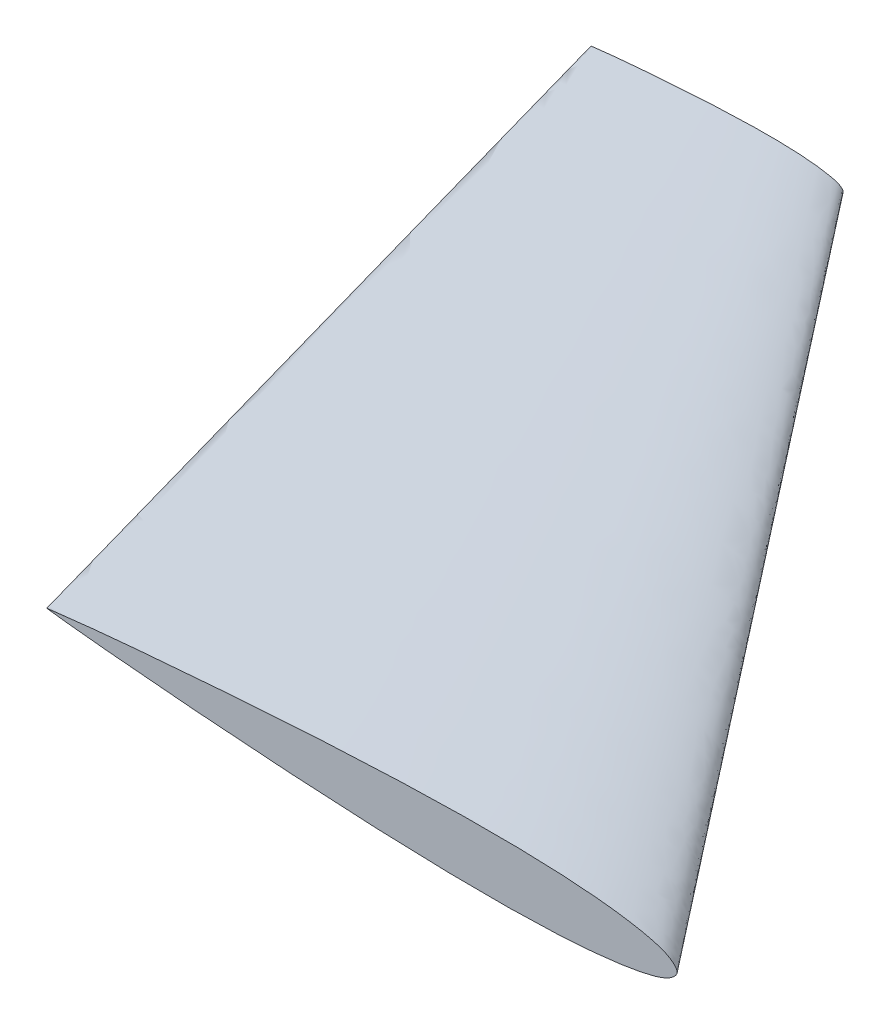
ISO-10303-21;
HEADER;
FILE_DESCRIPTION(('STEP AP214'),'2;1');
FILE_NAME('part.step','',(''),(''),'','','');
FILE_SCHEMA(('AUTOMOTIVE_DESIGN { 1 0 10303 214 1 1 1 1 }'));
ENDSEC;
DATA;
#1=APPLICATION_CONTEXT('core data for automotive mechanical design processes');
#2=APPLICATION_PROTOCOL_DEFINITION('international standard','automotive_design',2000,#1);
#3=PRODUCT_CONTEXT('',#1,'mechanical');
#4=PRODUCT('Part','Part','',(#3));
#5=PRODUCT_RELATED_PRODUCT_CATEGORY('part','',(#4));
#6=PRODUCT_DEFINITION_FORMATION('','',#4);
#7=PRODUCT_DEFINITION_CONTEXT('part definition',#1,'design');
#8=PRODUCT_DEFINITION('design','',#6,#7);
#9=PRODUCT_DEFINITION_SHAPE('','',#8);
#10=(LENGTH_UNIT() NAMED_UNIT(*) SI_UNIT(.MILLI.,.METRE.));
#11=(NAMED_UNIT(*) PLANE_ANGLE_UNIT() SI_UNIT($,.RADIAN.));
#12=(NAMED_UNIT(*) SI_UNIT($,.STERADIAN.) SOLID_ANGLE_UNIT());
#13=UNCERTAINTY_MEASURE_WITH_UNIT(LENGTH_MEASURE(1.E-05),#10,'distance_accuracy_value','');
#14=(GEOMETRIC_REPRESENTATION_CONTEXT(3) GLOBAL_UNCERTAINTY_ASSIGNED_CONTEXT((#13)) GLOBAL_UNIT_ASSIGNED_CONTEXT((#10,
#11,#12)) REPRESENTATION_CONTEXT('',''));
#15=CARTESIAN_POINT('',(0.,0.,0.));
#16=DIRECTION('',(0.,0.,1.));
#17=DIRECTION('',(1.,0.,0.));
#18=AXIS2_PLACEMENT_3D('',#15,#16,#17);
#19=CARTESIAN_POINT('',(0.,0.,0.));
#20=DIRECTION('',(0.,0.,-1.));
#21=DIRECTION('',(-1.,0.,0.));
#22=AXIS2_PLACEMENT_3D('',#19,#20,#21);
#23=PLANE('',#22);
#24=CARTESIAN_POINT('',(-9081.1,0.,0.));
#25=CARTESIAN_POINT('',(-9081.1,-1.73486146877975,0.));
#26=CARTESIAN_POINT('',(-8998.14637838142,-8.63726350122348,0.));
#27=CARTESIAN_POINT('',(-8913.06885725704,-23.040689798849,0.));
#28=CARTESIAN_POINT('',(-8706.40938286421,-45.1223122778045,0.));
#29=CARTESIAN_POINT('',(-8452.49878927744,-72.5318735213527,0.));
#30=CARTESIAN_POINT('',(-8121.65501098806,-104.696761112667,0.));
#31=CARTESIAN_POINT('',(-7733.22621171936,-140.192820859846,0.));
#32=CARTESIAN_POINT('',(-7288.91186404838,-178.334599574013,0.));
#33=CARTESIAN_POINT('',(-6798.00952122051,-218.005988327233,0.));
#34=CARTESIAN_POINT('',(-6268.34580161712,-257.622382709544,0.));
#35=CARTESIAN_POINT('',(-5709.15619436537,-296.009923370663,0.));
#36=CARTESIAN_POINT('',(-5129.96833348534,-331.402207321238,0.));
#37=CARTESIAN_POINT('',(-4540.69923785555,-362.300430453872,0.));
#38=CARTESIAN_POINT('',(-3951.41035711354,-386.867860581042,0.));
#39=CARTESIAN_POINT('',(-3464.83250408243,-401.060054935987,0.));
#40=CARTESIAN_POINT('',(-3083.13987093685,-407.579849365095,0.));
#41=CARTESIAN_POINT('',(-2805.45938075618,-409.893694320538,0.));
#42=CARTESIAN_POINT('',(-2535.18957654864,-409.57047843408,0.));
#43=CARTESIAN_POINT('',(-2273.48641822764,-406.091381072988,0.));
#44=CARTESIAN_POINT('',(-2021.4909483198,-399.984409565254,0.));
#45=CARTESIAN_POINT('',(-1780.30308864543,-390.761560277347,0.));
#46=CARTESIAN_POINT('',(-1550.93650582434,-378.758658465356,0.));
#47=CARTESIAN_POINT('',(-1334.34304282891,-363.695905699802,0.));
#48=CARTESIAN_POINT('',(-1131.44110780766,-345.828176766059,0.));
#49=CARTESIAN_POINT('',(-943.165132486444,-324.99902825195,0.));
#50=CARTESIAN_POINT('',(-770.299886657587,-301.605548142868,0.));
#51=CARTESIAN_POINT('',(-613.521281545593,-276.250802507782,0.));
#52=CARTESIAN_POINT('',(-473.482255008132,-249.048354499063,0.));
#53=CARTESIAN_POINT('',(-350.637729441108,-220.09247629371,0.));
#54=CARTESIAN_POINT('',(-245.569446870469,-188.408020354067,0.));
#55=CARTESIAN_POINT('',(-158.505460954369,-153.40812831918,0.));
#56=CARTESIAN_POINT('',(-90.2423986278794,-114.790563420673,0.));
#57=CARTESIAN_POINT('',(-41.1529290530634,-74.465303139355,0.));
#58=CARTESIAN_POINT('',(-10.4962132130873,-37.5056008950706,0.));
#59=CARTESIAN_POINT('',(4.29504875140931,0.,0.));
#60=CARTESIAN_POINT('',(-10.4962132130873,37.5056008950706,0.));
#61=CARTESIAN_POINT('',(-41.152929053063,74.4653031393546,0.));
#62=CARTESIAN_POINT('',(-90.2423986278806,114.790563420674,0.));
#63=CARTESIAN_POINT('',(-158.505460954368,153.408128319179,0.));
#64=CARTESIAN_POINT('',(-245.569446870469,188.408020354067,0.));
#65=CARTESIAN_POINT('',(-350.637729441107,220.09247629371,0.));
#66=CARTESIAN_POINT('',(-473.482255008132,249.048354499063,0.));
#67=CARTESIAN_POINT('',(-613.521281545593,276.250802507781,0.));
#68=CARTESIAN_POINT('',(-770.299886657588,301.605548142869,0.));
#69=CARTESIAN_POINT('',(-943.165132486444,324.99902825195,0.));
#70=CARTESIAN_POINT('',(-1131.44110780766,345.828176766059,0.));
#71=CARTESIAN_POINT('',(-1334.34304282892,363.695905699802,0.));
#72=CARTESIAN_POINT('',(-1550.93650582433,378.758658465356,0.));
#73=CARTESIAN_POINT('',(-1780.30308864544,390.761560277347,0.));
#74=CARTESIAN_POINT('',(-2021.4909483198,399.984409565254,0.));
#75=CARTESIAN_POINT('',(-2273.48641822764,406.091381072988,0.));
#76=CARTESIAN_POINT('',(-2535.18957654864,409.57047843408,0.));
#77=CARTESIAN_POINT('',(-2805.45938075618,409.893694320538,0.));
#78=CARTESIAN_POINT('',(-3083.13987093685,407.579849365095,0.));
#79=CARTESIAN_POINT('',(-3464.83250408243,401.060054935986,0.));
#80=CARTESIAN_POINT('',(-3951.41035711355,386.867860581042,0.));
#81=CARTESIAN_POINT('',(-4540.69923785555,362.300430453872,0.));
#82=CARTESIAN_POINT('',(-5129.96833348534,331.402207321238,0.));
#83=CARTESIAN_POINT('',(-5709.15619436537,296.009923370662,0.));
#84=CARTESIAN_POINT('',(-6268.34580161711,257.622382709544,0.));
#85=CARTESIAN_POINT('',(-6798.00952122051,218.005988327233,0.));
#86=CARTESIAN_POINT('',(-7288.91186404837,178.334599574013,0.));
#87=CARTESIAN_POINT('',(-7733.22621171936,140.192820859846,0.));
#88=CARTESIAN_POINT('',(-8121.65501098806,104.696761112667,0.));
#89=CARTESIAN_POINT('',(-8452.49878927744,72.5318735213527,0.));
#90=CARTESIAN_POINT('',(-8706.4093828642,45.1223122778046,0.));
#91=CARTESIAN_POINT('',(-8913.06885725704,23.0406897988486,0.));
#92=CARTESIAN_POINT('',(-8998.14637838142,8.63726350122393,0.));
#93=CARTESIAN_POINT('',(-9081.1,1.73486146877964,0.));
#94=CARTESIAN_POINT('',(-9081.1,0.,0.));
#95=B_SPLINE_CURVE_WITH_KNOTS('',3,(#24,#25,#26,#27,#28,#29,#30,#31,#32,#33,#34,#35,#36,#37,#38,
#39,#40,#41,#42,#43,#44,#45,#46,#47,#48,#49,#50,#51,#52,#53,#54,#55,#56,#57,#58,#59,#60,#61,#62,
#63,#64,#65,#66,#67,#68,#69,#70,#71,#72,#73,#74,#75,#76,#77,#78,#79,#80,#81,#82,#83,#84,#85,#86,
#87,#88,#89,#90,#91,#92,#93,#94),.UNSPECIFIED.,.T.,.F.,(4,1,1,1,1,1,1,1,1,1,1,1,1,1,1,1,1,1,1,1,
1,1,1,1,1,1,1,1,1,1,1,1,1,1,1,1,1,1,1,1,1,1,1,1,1,1,1,1,1,1,1,1,1,1,1,1,1,1,1,1,1,1,1,1,1,1,1,1,
4),(0.,0.00213342749536823,0.0084881557087433,0.0189444871418498,0.033319113775561,
0.0513562940971699,0.0727560928984787,0.0971408174352607,0.124097488782512,0.153162556777752,
0.183833917661665,0.215589374459111,0.247878194577005,0.280150867864074,0.311860397032406,
0.327332942728477,0.342462846119516,0.357187102446811,0.371448118351621,0.385183441042633,
0.398331272584713,0.410844637191414,0.422672607167313,0.433769314473499,0.444090175228778,
0.453589411782157,0.462240439844477,0.470010037325291,0.476870984677,0.482833353063501,
0.487908551351284,0.492155163583175,0.495592273393841,0.498196358984712,0.5,0.501803641015288,
0.504407726606159,0.507844836416825,0.512091448648716,0.517166646936499,0.523129015323,
0.529989962674709,0.537759560155523,0.546410588217843,0.555909824771222,0.566230685526501,
0.577327392832687,0.589155362808586,0.601668727415287,0.614816558957367,0.628551881648379,
0.642812897553189,0.657537153880484,0.672667057271523,0.688139602967594,0.719849132135926,
0.752121805422995,0.78441062554089,0.816166082338336,0.846837443222248,0.875902511217488,
0.90285918256474,0.927243907101521,0.94864370590283,0.966680886224439,0.98105551285815,
0.991511844291257,0.997866572504632,1.),.UNSPECIFIED.);
#96=CARTESIAN_POINT('',(-9081.1,0.,0.));
#97=VERTEX_POINT('',#96);
#98=EDGE_CURVE('E11',#97,#97,#95,.T.);
#99=ORIENTED_EDGE('',*,*,#98,.T.);
#100=EDGE_LOOP('',(#99));
#101=FACE_BOUND('',#100,.T.);
#102=ADVANCED_FACE('F47',(#101),#23,.F.);
#103=CARTESIAN_POINT('',(-8542.264526,-8.04177412768055E-13,-10933.6));
#104=DIRECTION('',(-1.28346758617793E-13,0.,-1.));
#105=DIRECTION('',(-1.,0.,1.28346758617793E-13));
#106=AXIS2_PLACEMENT_3D('',#103,#104,#105);
#107=PLANE('',#106);
#108=CARTESIAN_POINT('',(-12174.66453,0.,-10933.6));
#109=CARTESIAN_POINT('',(-12174.66453,-0.693936892304296,-10933.6));
#110=CARTESIAN_POINT('',(-12141.4834432637,-3.45486586808051,-10933.6));
#111=CARTESIAN_POINT('',(-12107.4528067983,-9.21617565616754,-10933.6));
#112=CARTESIAN_POINT('',(-12024.7899290209,-18.0487254160651,-10933.6));
#113=CARTESIAN_POINT('',(-11923.2268104864,-29.0124301956125,-10933.6));
#114=CARTESIAN_POINT('',(-11790.8907585336,-41.8782431861488,-10933.6));
#115=CARTESIAN_POINT('',(-11635.5209504227,-56.0765111057272,-10933.6));
#116=CARTESIAN_POINT('',(-11457.7971690761,-71.3330540117367,-10933.6));
#117=CARTESIAN_POINT('',(-11261.4383923059,-87.2014355334954,-10933.6));
#118=CARTESIAN_POINT('',(-11049.5752367677,-103.047817876034,-10933.6));
#119=CARTESIAN_POINT('',(-10825.9018556702,-118.402665675267,-10933.6));
#120=CARTESIAN_POINT('',(-10594.2292644743,-132.55942297644,-10933.6));
#121=CARTESIAN_POINT('',(-10358.5242211673,-144.918576677279,-10933.6));
#122=CARTESIAN_POINT('',(-10122.8112645173,-154.745439945449,-10933.6));
#123=CARTESIAN_POINT('',(-9928.1822652372,-160.4222554413,-10933.6));
#124=CARTESIAN_POINT('',(-9775.50689390581,-163.030144452895,-10933.6));
#125=CARTESIAN_POINT('',(-9664.43592094766,-163.955672249056,-10933.6));
#126=CARTESIAN_POINT('',(-9556.32918973624,-163.82638731664,-10933.6));
#127=CARTESIAN_POINT('',(-9451.64907914556,-162.434763697155,-10933.6));
#128=CARTESIAN_POINT('',(-9350.85200116015,-159.992001993663,-10933.6));
#129=CARTESIAN_POINT('',(-9254.37791966329,-156.302902902895,-10933.6));
#130=CARTESIAN_POINT('',(-9162.63229683793,-151.501795047907,-10933.6));
#131=CARTESIAN_POINT('',(-9075.99586568041,-145.476760289388,-10933.6));
#132=CARTESIAN_POINT('',(-8994.83598540476,-138.329747418818,-10933.6));
#133=CARTESIAN_POINT('',(-8919.52642458539,-129.998179760424,-10933.6));
#134=CARTESIAN_POINT('',(-8850.3810876825,-120.640890759287,-10933.6));
#135=CARTESIAN_POINT('',(-8787.6703362087,-110.499104186636,-10933.6));
#136=CARTESIAN_POINT('',(-8731.655342431,-99.6182448032066,-10933.6));
#137=CARTESIAN_POINT('',(-8682.51807330395,-88.0360210645486,-10933.6));
#138=CARTESIAN_POINT('',(-8640.4912230755,-75.3623782508849,-10933.6));
#139=CARTESIAN_POINT('',(-8605.66601220439,-61.3625756028004,-10933.6));
#140=CARTESIAN_POINT('',(-8578.3610879557,-45.9157197442213,-10933.6));
#141=CARTESIAN_POINT('',(-8558.72551635275,-29.7857932544953,-10933.6));
#142=CARTESIAN_POINT('',(-8546.46296505201,-15.0020751551302,-10933.6));
#143=CARTESIAN_POINT('',(-8540.54652541807,0.,-10933.6));
#144=CARTESIAN_POINT('',(-8546.46296505201,15.0020751551297,-10933.6));
#145=CARTESIAN_POINT('',(-8558.72551635275,29.785793254496,-10933.6));
#146=CARTESIAN_POINT('',(-8578.3610879557,45.9157197442211,-10933.6));
#147=CARTESIAN_POINT('',(-8605.66601220438,61.3625756028002,-10933.6));
#148=CARTESIAN_POINT('',(-8640.4912230755,75.3623782508852,-10933.6));
#149=CARTESIAN_POINT('',(-8682.51807330394,88.0360210645484,-10933.6));
#150=CARTESIAN_POINT('',(-8731.655342431,99.6182448032067,-10933.6));
#151=CARTESIAN_POINT('',(-8787.6703362087,110.499104186636,-10933.6));
#152=CARTESIAN_POINT('',(-8850.3810876825,120.640890759287,-10933.6));
#153=CARTESIAN_POINT('',(-8919.52642458539,129.998179760424,-10933.6));
#154=CARTESIAN_POINT('',(-8994.83598540476,138.329747418818,-10933.6));
#155=CARTESIAN_POINT('',(-9075.99586568041,145.476760289388,-10933.6));
#156=CARTESIAN_POINT('',(-9162.63229683793,151.501795047907,-10933.6));
#157=CARTESIAN_POINT('',(-9254.37791966329,156.302902902895,-10933.6));
#158=CARTESIAN_POINT('',(-9350.85200116014,159.992001993663,-10933.6));
#159=CARTESIAN_POINT('',(-9451.64907914556,162.434763697155,-10933.6));
#160=CARTESIAN_POINT('',(-9556.32918973624,163.82638731664,-10933.6));
#161=CARTESIAN_POINT('',(-9664.43592094766,163.955672249056,-10933.6));
#162=CARTESIAN_POINT('',(-9775.50689390581,163.030144452895,-10933.6));
#163=CARTESIAN_POINT('',(-9928.1822652372,160.4222554413,-10933.6));
#164=CARTESIAN_POINT('',(-10122.8112645173,154.745439945449,-10933.6));
#165=CARTESIAN_POINT('',(-10358.5242211673,144.918576677279,-10933.6));
#166=CARTESIAN_POINT('',(-10594.2292644743,132.55942297644,-10933.6));
#167=CARTESIAN_POINT('',(-10825.9018556702,118.402665675267,-10933.6));
#168=CARTESIAN_POINT('',(-11049.5752367677,103.047817876034,-10933.6));
#169=CARTESIAN_POINT('',(-11261.4383923059,87.2014355334954,-10933.6));
#170=CARTESIAN_POINT('',(-11457.7971690761,71.3330540117367,-10933.6));
#171=CARTESIAN_POINT('',(-11635.5209504227,56.0765111057273,-10933.6));
#172=CARTESIAN_POINT('',(-11790.8907585336,41.8782431861488,-10933.6));
#173=CARTESIAN_POINT('',(-11923.2268104864,29.0124301956124,-10933.6));
#174=CARTESIAN_POINT('',(-12024.7899290209,18.0487254160652,-10933.6));
#175=CARTESIAN_POINT('',(-12107.4528067983,9.21617565616752,-10933.6));
#176=CARTESIAN_POINT('',(-12141.4834432637,3.45486586808051,-10933.6));
#177=CARTESIAN_POINT('',(-12174.66453,0.693936892304311,-10933.6));
#178=CARTESIAN_POINT('',(-12174.66453,0.,-10933.6));
#179=B_SPLINE_CURVE_WITH_KNOTS('',3,(#108,#109,#110,#111,#112,#113,#114,#115,#116,#117,#118,
#119,#120,#121,#122,#123,#124,#125,#126,#127,#128,#129,#130,#131,#132,#133,#134,#135,#136,#137,
#138,#139,#140,#141,#142,#143,#144,#145,#146,#147,#148,#149,#150,#151,#152,#153,#154,#155,#156,
#157,#158,#159,#160,#161,#162,#163,#164,#165,#166,#167,#168,#169,#170,#171,#172,#173,#174,#175,
#176,#177,#178),.UNSPECIFIED.,.T.,.F.,(4,1,1,1,1,1,1,1,1,1,1,1,1,1,1,1,1,1,1,1,1,1,1,1,1,1,1,1,
1,1,1,1,1,1,1,1,1,1,1,1,1,1,1,1,1,1,1,1,1,1,1,1,1,1,1,1,1,1,1,1,1,1,1,1,1,1,1,1,4),(0.,
0.00213342857175305,0.00848815623844794,0.0189444879304978,0.0333191142781687,
0.0513562943095712,0.0727560928168763,0.0971408175984043,0.124097488645405,0.153162557423173,
0.183833918002581,0.215589374765771,0.247878194305465,0.28015086837318,0.311860397235364,
0.327332942914743,0.34246284628946,0.357187102600871,0.371448118490297,0.385183441166493,
0.398331272694389,0.410844637287591,0.42267260725073,0.433769314544946,0.444090175289092,
0.453589411832222,0.46224043988521,0.470010037357643,0.47687098470195,0.482833353082019,
0.487908551364328,0.492155163591638,0.495592273398596,0.498196358986657,0.5,0.501803641013343,
0.504407726601404,0.507844836408362,0.512091448635672,0.517166646917981,0.52312901529805,
0.529989962642357,0.53775956011479,0.546410588167778,0.555909824710909,0.566230685455054,
0.57732739274927,0.589155362712409,0.601668727305611,0.614816558833508,0.628551881509703,
0.642812897399129,0.65753715371054,0.672667057085257,0.688139602764637,0.71984913162682,
0.752121805694535,0.784410625234229,0.816166081997419,0.846837442576827,0.875902511354595,
0.902859182401596,0.927243907183124,0.948643705690429,0.966680885721831,0.981055512069502,
0.991511843761552,0.997866571428247,1.),.UNSPECIFIED.);
#180=CARTESIAN_POINT('',(-12174.66453,0.,-10933.6));
#181=VERTEX_POINT('',#180);
#182=EDGE_CURVE('E57',#181,#181,#179,.T.);
#183=ORIENTED_EDGE('',*,*,#182,.F.);
#184=EDGE_LOOP('',(#183));
#185=FACE_BOUND('',#184,.T.);
#186=ADVANCED_FACE('F85',(#185),#107,.T.);
#187=CARTESIAN_POINT('',(-12174.6645314733,-3.3225594525026E-07,-10933.6));
#188=CARTESIAN_POINT('',(-9081.09999631666,-8.30649402993461E-07,0.));
#189=CARTESIAN_POINT('',(-12174.6645295841,-0.693936926911336,-10933.6));
#190=CARTESIAN_POINT('',(-9081.09999159353,-1.73486216826496,0.));
#191=CARTESIAN_POINT('',(-12141.4834432637,-3.45486586808051,-10933.6));
#192=CARTESIAN_POINT('',(-8998.14637838142,-8.63726350122348,0.));
#193=CARTESIAN_POINT('',(-12107.4528067983,-9.21617565616754,-10933.6));
#194=CARTESIAN_POINT('',(-8913.06885725704,-23.040689798849,0.));
#195=CARTESIAN_POINT('',(-12024.7899290209,-18.0487254160651,-10933.6));
#196=CARTESIAN_POINT('',(-8706.40938286421,-45.1223122778045,0.));
#197=CARTESIAN_POINT('',(-11923.2268104864,-29.0124301956125,-10933.6));
#198=CARTESIAN_POINT('',(-8452.49878927744,-72.5318735213527,0.));
#199=CARTESIAN_POINT('',(-11790.8907585336,-41.8782431861488,-10933.6));
#200=CARTESIAN_POINT('',(-8121.65501098806,-104.696761112667,0.));
#201=CARTESIAN_POINT('',(-11635.5209504227,-56.0765111057272,-10933.6));
#202=CARTESIAN_POINT('',(-7733.22621171936,-140.192820859846,0.));
#203=CARTESIAN_POINT('',(-11457.7971690761,-71.3330540117367,-10933.6));
#204=CARTESIAN_POINT('',(-7288.91186404838,-178.334599574013,0.));
#205=CARTESIAN_POINT('',(-11261.4383923059,-87.2014355334954,-10933.6));
#206=CARTESIAN_POINT('',(-6798.00952122051,-218.005988327233,0.));
#207=CARTESIAN_POINT('',(-11049.5752367677,-103.047817876034,-10933.6));
#208=CARTESIAN_POINT('',(-6268.34580161712,-257.622382709544,0.));
#209=CARTESIAN_POINT('',(-10825.9018556702,-118.402665675267,-10933.6));
#210=CARTESIAN_POINT('',(-5709.15619436537,-296.009923370663,0.));
#211=CARTESIAN_POINT('',(-10594.2292644743,-132.55942297644,-10933.6));
#212=CARTESIAN_POINT('',(-5129.96833348534,-331.402207321238,0.));
#213=CARTESIAN_POINT('',(-10358.5242211673,-144.918576677279,-10933.6));
#214=CARTESIAN_POINT('',(-4540.69923785555,-362.300430453872,0.));
#215=CARTESIAN_POINT('',(-10122.8112645173,-154.745439945449,-10933.6));
#216=CARTESIAN_POINT('',(-3951.41035711354,-386.867860581042,0.));
#217=CARTESIAN_POINT('',(-9928.1822652372,-160.4222554413,-10933.6));
#218=CARTESIAN_POINT('',(-3464.83250408243,-401.060054935987,0.));
#219=CARTESIAN_POINT('',(-9775.50689390581,-163.030144452895,-10933.6));
#220=CARTESIAN_POINT('',(-3083.13987093685,-407.579849365095,0.));
#221=CARTESIAN_POINT('',(-9664.43592094766,-163.955672249056,-10933.6));
#222=CARTESIAN_POINT('',(-2805.45938075618,-409.893694320538,0.));
#223=CARTESIAN_POINT('',(-9556.32918973624,-163.82638731664,-10933.6));
#224=CARTESIAN_POINT('',(-2535.18957654864,-409.57047843408,0.));
#225=CARTESIAN_POINT('',(-9451.64907914556,-162.434763697155,-10933.6));
#226=CARTESIAN_POINT('',(-2273.48641822764,-406.091381072988,0.));
#227=CARTESIAN_POINT('',(-9350.85200116015,-159.992001993663,-10933.6));
#228=CARTESIAN_POINT('',(-2021.4909483198,-399.984409565254,0.));
#229=CARTESIAN_POINT('',(-9254.37791966329,-156.302902902895,-10933.6));
#230=CARTESIAN_POINT('',(-1780.30308864543,-390.761560277347,0.));
#231=CARTESIAN_POINT('',(-9162.63229683793,-151.501795047907,-10933.6));
#232=CARTESIAN_POINT('',(-1550.93650582434,-378.758658465356,0.));
#233=CARTESIAN_POINT('',(-9075.99586568041,-145.476760289388,-10933.6));
#234=CARTESIAN_POINT('',(-1334.34304282891,-363.695905699802,0.));
#235=CARTESIAN_POINT('',(-8994.83598540476,-138.329747418818,-10933.6));
#236=CARTESIAN_POINT('',(-1131.44110780766,-345.828176766059,0.));
#237=CARTESIAN_POINT('',(-8919.52642458539,-129.998179760424,-10933.6));
#238=CARTESIAN_POINT('',(-943.165132486444,-324.99902825195,0.));
#239=CARTESIAN_POINT('',(-8850.3810876825,-120.640890759287,-10933.6));
#240=CARTESIAN_POINT('',(-770.299886657587,-301.605548142868,0.));
#241=CARTESIAN_POINT('',(-8787.6703362087,-110.499104186636,-10933.6));
#242=CARTESIAN_POINT('',(-613.521281545593,-276.250802507782,0.));
#243=CARTESIAN_POINT('',(-8731.655342431,-99.6182448032066,-10933.6));
#244=CARTESIAN_POINT('',(-473.482255008132,-249.048354499063,0.));
#245=CARTESIAN_POINT('',(-8682.51807330395,-88.0360210645486,-10933.6));
#246=CARTESIAN_POINT('',(-350.637729441108,-220.09247629371,0.));
#247=CARTESIAN_POINT('',(-8640.4912230755,-75.3623782508849,-10933.6));
#248=CARTESIAN_POINT('',(-245.569446870469,-188.408020354067,0.));
#249=CARTESIAN_POINT('',(-8605.66601220439,-61.3625756028004,-10933.6));
#250=CARTESIAN_POINT('',(-158.505460954369,-153.40812831918,0.));
#251=CARTESIAN_POINT('',(-8578.3610879557,-45.9157197442213,-10933.6));
#252=CARTESIAN_POINT('',(-90.2423986278794,-114.790563420673,0.));
#253=CARTESIAN_POINT('',(-8558.72551635275,-29.7857932544953,-10933.6));
#254=CARTESIAN_POINT('',(-41.1529290530634,-74.465303139355,0.));
#255=CARTESIAN_POINT('',(-8546.46296505201,-15.0020751551302,-10933.6));
#256=CARTESIAN_POINT('',(-10.4962132130873,-37.5056008950706,0.));
#257=CARTESIAN_POINT('',(-8540.54652541807,0.,-10933.6));
#258=CARTESIAN_POINT('',(4.29504875140931,0.,0.));
#259=CARTESIAN_POINT('',(-8546.46296505201,15.0020751551297,-10933.6));
#260=CARTESIAN_POINT('',(-10.4962132130873,37.5056008950706,0.));
#261=CARTESIAN_POINT('',(-8558.72551635275,29.785793254496,-10933.6));
#262=CARTESIAN_POINT('',(-41.152929053063,74.4653031393546,0.));
#263=CARTESIAN_POINT('',(-8578.3610879557,45.9157197442211,-10933.6));
#264=CARTESIAN_POINT('',(-90.2423986278806,114.790563420674,0.));
#265=CARTESIAN_POINT('',(-8605.66601220438,61.3625756028002,-10933.6));
#266=CARTESIAN_POINT('',(-158.505460954368,153.408128319179,0.));
#267=CARTESIAN_POINT('',(-8640.4912230755,75.3623782508852,-10933.6));
#268=CARTESIAN_POINT('',(-245.569446870469,188.408020354067,0.));
#269=CARTESIAN_POINT('',(-8682.51807330394,88.0360210645484,-10933.6));
#270=CARTESIAN_POINT('',(-350.637729441107,220.09247629371,0.));
#271=CARTESIAN_POINT('',(-8731.655342431,99.6182448032067,-10933.6));
#272=CARTESIAN_POINT('',(-473.482255008132,249.048354499063,0.));
#273=CARTESIAN_POINT('',(-8787.6703362087,110.499104186636,-10933.6));
#274=CARTESIAN_POINT('',(-613.521281545593,276.250802507781,0.));
#275=CARTESIAN_POINT('',(-8850.3810876825,120.640890759287,-10933.6));
#276=CARTESIAN_POINT('',(-770.299886657588,301.605548142869,0.));
#277=CARTESIAN_POINT('',(-8919.52642458539,129.998179760424,-10933.6));
#278=CARTESIAN_POINT('',(-943.165132486444,324.99902825195,0.));
#279=CARTESIAN_POINT('',(-8994.83598540476,138.329747418818,-10933.6));
#280=CARTESIAN_POINT('',(-1131.44110780766,345.828176766059,0.));
#281=CARTESIAN_POINT('',(-9075.99586568041,145.476760289388,-10933.6));
#282=CARTESIAN_POINT('',(-1334.34304282892,363.695905699802,0.));
#283=CARTESIAN_POINT('',(-9162.63229683793,151.501795047907,-10933.6));
#284=CARTESIAN_POINT('',(-1550.93650582433,378.758658465356,0.));
#285=CARTESIAN_POINT('',(-9254.37791966329,156.302902902895,-10933.6));
#286=CARTESIAN_POINT('',(-1780.30308864544,390.761560277347,0.));
#287=CARTESIAN_POINT('',(-9350.85200116014,159.992001993663,-10933.6));
#288=CARTESIAN_POINT('',(-2021.4909483198,399.984409565254,0.));
#289=CARTESIAN_POINT('',(-9451.64907914556,162.434763697155,-10933.6));
#290=CARTESIAN_POINT('',(-2273.48641822764,406.091381072988,0.));
#291=CARTESIAN_POINT('',(-9556.32918973624,163.82638731664,-10933.6));
#292=CARTESIAN_POINT('',(-2535.18957654864,409.57047843408,0.));
#293=CARTESIAN_POINT('',(-9664.43592094766,163.955672249056,-10933.6));
#294=CARTESIAN_POINT('',(-2805.45938075618,409.893694320538,0.));
#295=CARTESIAN_POINT('',(-9775.50689390581,163.030144452895,-10933.6));
#296=CARTESIAN_POINT('',(-3083.13987093685,407.579849365095,0.));
#297=CARTESIAN_POINT('',(-9928.1822652372,160.4222554413,-10933.6));
#298=CARTESIAN_POINT('',(-3464.83250408243,401.060054935986,0.));
#299=CARTESIAN_POINT('',(-10122.8112645173,154.745439945449,-10933.6));
#300=CARTESIAN_POINT('',(-3951.41035711355,386.867860581042,0.));
#301=CARTESIAN_POINT('',(-10358.5242211673,144.918576677279,-10933.6));
#302=CARTESIAN_POINT('',(-4540.69923785555,362.300430453872,0.));
#303=CARTESIAN_POINT('',(-10594.2292644743,132.55942297644,-10933.6));
#304=CARTESIAN_POINT('',(-5129.96833348534,331.402207321238,0.));
#305=CARTESIAN_POINT('',(-10825.9018556702,118.402665675267,-10933.6));
#306=CARTESIAN_POINT('',(-5709.15619436537,296.009923370662,0.));
#307=CARTESIAN_POINT('',(-11049.5752367677,103.047817876034,-10933.6));
#308=CARTESIAN_POINT('',(-6268.34580161711,257.622382709544,0.));
#309=CARTESIAN_POINT('',(-11261.4383923059,87.2014355334954,-10933.6));
#310=CARTESIAN_POINT('',(-6798.00952122051,218.005988327233,0.));
#311=CARTESIAN_POINT('',(-11457.7971690761,71.3330540117367,-10933.6));
#312=CARTESIAN_POINT('',(-7288.91186404837,178.334599574013,0.));
#313=CARTESIAN_POINT('',(-11635.5209504227,56.0765111057273,-10933.6));
#314=CARTESIAN_POINT('',(-7733.22621171936,140.192820859846,0.));
#315=CARTESIAN_POINT('',(-11790.8907585336,41.8782431861488,-10933.6));
#316=CARTESIAN_POINT('',(-8121.65501098806,104.696761112667,0.));
#317=CARTESIAN_POINT('',(-11923.2268104864,29.0124301956124,-10933.6));
#318=CARTESIAN_POINT('',(-8452.49878927744,72.5318735213527,0.));
#319=CARTESIAN_POINT('',(-12024.7899290209,18.0487254160652,-10933.6));
#320=CARTESIAN_POINT('',(-8706.4093828642,45.1223122778046,0.));
#321=CARTESIAN_POINT('',(-12107.4528067983,9.21617565616752,-10933.6));
#322=CARTESIAN_POINT('',(-8913.06885725704,23.0406897988486,0.));
#323=CARTESIAN_POINT('',(-12141.4834432637,3.45486586808051,-10933.6));
#324=CARTESIAN_POINT('',(-8998.14637838142,8.63726350122393,0.));
#325=CARTESIAN_POINT('',(-12174.6645333625,0.69393661251341,-10933.6));
#326=CARTESIAN_POINT('',(-9081.10000103979,1.73486138226108,0.));
#327=CARTESIAN_POINT('',(-12174.6645314733,-3.3225594525026E-07,-10933.6));
#328=CARTESIAN_POINT('',(-9081.09999631666,-8.30649402993461E-07,0.));
#329=B_SPLINE_SURFACE_WITH_KNOTS('',3,1,((#187,#188),(#189,#190),(#191,#192),(#193,#194),(#195,
#196),(#197,#198),(#199,#200),(#201,#202),(#203,#204),(#205,#206),(#207,#208),(#209,#210),(#211,
#212),(#213,#214),(#215,#216),(#217,#218),(#219,#220),(#221,#222),(#223,#224),(#225,#226),(#227,
#228),(#229,#230),(#231,#232),(#233,#234),(#235,#236),(#237,#238),(#239,#240),(#241,#242),(#243,
#244),(#245,#246),(#247,#248),(#249,#250),(#251,#252),(#253,#254),(#255,#256),(#257,#258),(#259,
#260),(#261,#262),(#263,#264),(#265,#266),(#267,#268),(#269,#270),(#271,#272),(#273,#274),(#275,
#276),(#277,#278),(#279,#280),(#281,#282),(#283,#284),(#285,#286),(#287,#288),(#289,#290),(#291,
#292),(#293,#294),(#295,#296),(#297,#298),(#299,#300),(#301,#302),(#303,#304),(#305,#306),(#307,
#308),(#309,#310),(#311,#312),(#313,#314),(#315,#316),(#317,#318),(#319,#320),(#321,#322),(#323,
#324),(#325,#326),(#327,#328)),.UNSPECIFIED.,.T.,.F.,.F.,(4,1,1,1,1,1,1,1,1,1,1,1,1,1,1,1,1,1,1,
1,1,1,1,1,1,1,1,1,1,1,1,1,1,1,1,1,1,1,1,1,1,1,1,1,1,1,1,1,1,1,1,1,1,1,1,1,1,1,1,1,1,1,1,1,1,1,1,
1,4),(2,2),(0.,0.00213342749536823,0.0084881557087433,0.0189444871418498,0.033319113775561,
0.0513562940971699,0.0727560928168763,0.0971408174352607,0.124097488645405,0.153162556777752,
0.183833917661665,0.215589374459111,0.247878194305465,0.280150867864074,0.311860397032406,
0.327332942728477,0.342462846119516,0.357187102446811,0.371448118351621,0.385183441042633,
0.398331272584713,0.410844637191414,0.422672607167313,0.433769314473499,0.444090175228778,
0.453589411782157,0.462240439844477,0.470010037325291,0.476870984677,0.482833353063501,
0.487908551351284,0.492155163583175,0.495592273393841,0.498196358984712,0.5,0.501803641013343,
0.504407726601404,0.507844836408362,0.512091448635672,0.517166646917981,0.52312901529805,
0.529989962642357,0.53775956011479,0.546410588167778,0.555909824710909,0.566230685455054,
0.57732739274927,0.589155362712409,0.601668727305611,0.614816558833508,0.628551881509703,
0.642812897399129,0.65753715371054,0.672667057085257,0.688139602764637,0.71984913162682,
0.752121805422995,0.784410625234229,0.816166081997419,0.846837442576827,0.875902511217488,
0.902859182401596,0.927243907101521,0.948643705690429,0.966680885721831,0.981055512069502,
0.991511843761552,0.997866571428247,1.),(0.,1.),.UNSPECIFIED.);
#330=ORIENTED_EDGE('',*,*,#182,.T.);
#331=EDGE_LOOP('',(#330));
#332=FACE_BOUND('',#331,.T.);
#333=ORIENTED_EDGE('',*,*,#98,.F.);
#334=EDGE_LOOP('',(#333));
#335=FACE_BOUND('',#334,.T.);
#336=ADVANCED_FACE('F93',(#332,#335),#329,.T.);
#337=CLOSED_SHELL('',(#102,#186,#336));
#338=MANIFOLD_SOLID_BREP('B2',#337);
#339=ADVANCED_BREP_SHAPE_REPRESENTATION('',(#18,#338),#14);
#340=SHAPE_DEFINITION_REPRESENTATION(#9,#339);
ENDSEC;
END-ISO-10303-21;
